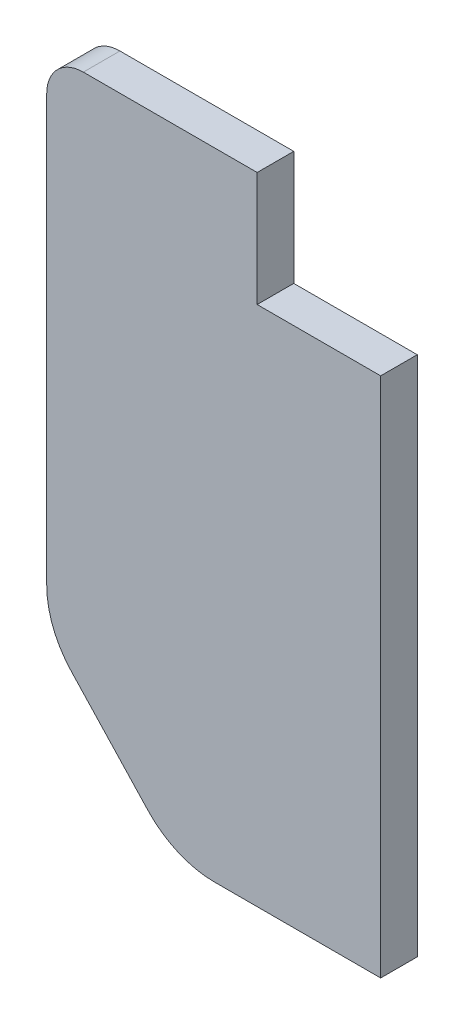
ISO-10303-21;
HEADER;
FILE_DESCRIPTION(('STEP AP214'),'2;1');
FILE_NAME('part.step','',(''),(''),'','','');
FILE_SCHEMA(('AUTOMOTIVE_DESIGN { 1 0 10303 214 1 1 1 1 }'));
ENDSEC;
DATA;
#1=APPLICATION_CONTEXT('core data for automotive mechanical design processes');
#2=APPLICATION_PROTOCOL_DEFINITION('international standard','automotive_design',2000,#1);
#3=PRODUCT_CONTEXT('',#1,'mechanical');
#4=PRODUCT('Part','Part','',(#3));
#5=PRODUCT_RELATED_PRODUCT_CATEGORY('part','',(#4));
#6=PRODUCT_DEFINITION_FORMATION('','',#4);
#7=PRODUCT_DEFINITION_CONTEXT('part definition',#1,'design');
#8=PRODUCT_DEFINITION('design','',#6,#7);
#9=PRODUCT_DEFINITION_SHAPE('','',#8);
#10=(LENGTH_UNIT() NAMED_UNIT(*) SI_UNIT(.MILLI.,.METRE.));
#11=(NAMED_UNIT(*) PLANE_ANGLE_UNIT() SI_UNIT($,.RADIAN.));
#12=(NAMED_UNIT(*) SI_UNIT($,.STERADIAN.) SOLID_ANGLE_UNIT());
#13=UNCERTAINTY_MEASURE_WITH_UNIT(LENGTH_MEASURE(1.E-05),#10,'distance_accuracy_value','');
#14=(GEOMETRIC_REPRESENTATION_CONTEXT(3) GLOBAL_UNCERTAINTY_ASSIGNED_CONTEXT((#13)) GLOBAL_UNIT_ASSIGNED_CONTEXT((#10,
#11,#12)) REPRESENTATION_CONTEXT('',''));
#15=CARTESIAN_POINT('',(0.,0.,0.));
#16=DIRECTION('',(0.,0.,1.));
#17=DIRECTION('',(1.,0.,0.));
#18=AXIS2_PLACEMENT_3D('',#15,#16,#17);
#19=CARTESIAN_POINT('',(-45.,0.,8.));
#20=DIRECTION('',(0.,1.,0.));
#21=DIRECTION('',(0.,0.,1.));
#22=AXIS2_PLACEMENT_3D('',#19,#20,#21);
#23=PLANE('',#22);
#24=DIRECTION('',(1.,0.,0.));
#25=VECTOR('',#24,1.);
#26=CARTESIAN_POINT('',(-45.,0.,8.));
#27=LINE('',#26,#25);
#28=CARTESIAN_POINT('',(-36.3089539617557,0.,8.));
#29=VERTEX_POINT('',#28);
#30=CARTESIAN_POINT('',(0.,0.,8.));
#31=VERTEX_POINT('',#30);
#32=EDGE_CURVE('E112',#29,#31,#27,.T.);
#33=ORIENTED_EDGE('',*,*,#32,.F.);
#34=DIRECTION('',(0.,0.,-1.));
#35=VECTOR('',#34,1.);
#36=CARTESIAN_POINT('',(-36.3089539617557,0.,8.));
#37=LINE('',#36,#35);
#38=CARTESIAN_POINT('',(-36.3089539617557,0.,0.));
#39=VERTEX_POINT('',#38);
#40=EDGE_CURVE('E150',#29,#39,#37,.T.);
#41=ORIENTED_EDGE('',*,*,#40,.T.);
#42=DIRECTION('',(1.,0.,0.));
#43=VECTOR('',#42,1.);
#44=CARTESIAN_POINT('',(-45.,0.,0.));
#45=LINE('',#44,#43);
#46=CARTESIAN_POINT('',(0.,0.,0.));
#47=VERTEX_POINT('',#46);
#48=EDGE_CURVE('E134',#39,#47,#45,.T.);
#49=ORIENTED_EDGE('',*,*,#48,.T.);
#50=DIRECTION('',(0.,0.,-1.));
#51=VECTOR('',#50,1.);
#52=CARTESIAN_POINT('',(0.,0.,8.));
#53=LINE('',#52,#51);
#54=EDGE_CURVE('E127',#31,#47,#53,.T.);
#55=ORIENTED_EDGE('',*,*,#54,.F.);
#56=EDGE_LOOP('',(#33,#41,#49,#55));
#57=FACE_BOUND('',#56,.T.);
#58=ADVANCED_FACE('F34',(#57),#23,.F.);
#59=CARTESIAN_POINT('',(0.,0.,8.));
#60=DIRECTION('',(-1.,0.,0.));
#61=DIRECTION('',(0.,0.,1.));
#62=AXIS2_PLACEMENT_3D('',#59,#60,#61);
#63=PLANE('',#62);
#64=DIRECTION('',(0.,1.,0.));
#65=VECTOR('',#64,1.);
#66=CARTESIAN_POINT('',(0.,0.,0.));
#67=LINE('',#66,#65);
#68=CARTESIAN_POINT('',(0.,114.,0.));
#69=VERTEX_POINT('',#68);
#70=EDGE_CURVE('E197',#47,#69,#67,.T.);
#71=ORIENTED_EDGE('',*,*,#70,.T.);
#72=DIRECTION('',(0.,0.,-1.));
#73=VECTOR('',#72,1.);
#74=CARTESIAN_POINT('',(0.,114.,8.));
#75=LINE('',#74,#73);
#76=CARTESIAN_POINT('',(0.,114.,8.));
#77=VERTEX_POINT('',#76);
#78=EDGE_CURVE('E129',#77,#69,#75,.T.);
#79=ORIENTED_EDGE('',*,*,#78,.F.);
#80=DIRECTION('',(0.,1.,0.));
#81=VECTOR('',#80,1.);
#82=CARTESIAN_POINT('',(0.,0.,8.));
#83=LINE('',#82,#81);
#84=EDGE_CURVE('E115',#31,#77,#83,.T.);
#85=ORIENTED_EDGE('',*,*,#84,.F.);
#86=ORIENTED_EDGE('',*,*,#54,.T.);
#87=EDGE_LOOP('',(#71,#79,#85,#86));
#88=FACE_BOUND('',#87,.T.);
#89=ADVANCED_FACE('F126',(#88),#63,.F.);
#90=CARTESIAN_POINT('',(0.,114.,8.));
#91=DIRECTION('',(0.,-1.,0.));
#92=DIRECTION('',(0.,0.,-1.));
#93=AXIS2_PLACEMENT_3D('',#90,#91,#92);
#94=PLANE('',#93);
#95=DIRECTION('',(-1.,0.,0.));
#96=VECTOR('',#95,1.);
#97=CARTESIAN_POINT('',(0.,114.,0.));
#98=LINE('',#97,#96);
#99=CARTESIAN_POINT('',(-27.,114.,0.));
#100=VERTEX_POINT('',#99);
#101=EDGE_CURVE('E196',#69,#100,#98,.T.);
#102=ORIENTED_EDGE('',*,*,#101,.T.);
#103=DIRECTION('',(0.,0.,-1.));
#104=VECTOR('',#103,1.);
#105=CARTESIAN_POINT('',(-27.,114.,8.));
#106=LINE('',#105,#104);
#107=CARTESIAN_POINT('',(-27.,114.,8.));
#108=VERTEX_POINT('',#107);
#109=EDGE_CURVE('E141',#108,#100,#106,.T.);
#110=ORIENTED_EDGE('',*,*,#109,.F.);
#111=DIRECTION('',(-1.,0.,0.));
#112=VECTOR('',#111,1.);
#113=CARTESIAN_POINT('',(0.,114.,8.));
#114=LINE('',#113,#112);
#115=EDGE_CURVE('E131',#77,#108,#114,.T.);
#116=ORIENTED_EDGE('',*,*,#115,.F.);
#117=ORIENTED_EDGE('',*,*,#78,.T.);
#118=EDGE_LOOP('',(#102,#110,#116,#117));
#119=FACE_BOUND('',#118,.T.);
#120=ADVANCED_FACE('F207',(#119),#94,.F.);
#121=CARTESIAN_POINT('',(-27.,114.,8.));
#122=DIRECTION('',(-1.,0.,0.));
#123=DIRECTION('',(0.,-1.,0.));
#124=AXIS2_PLACEMENT_3D('',#121,#122,#123);
#125=PLANE('',#124);
#126=DIRECTION('',(0.,1.,0.));
#127=VECTOR('',#126,1.);
#128=CARTESIAN_POINT('',(-27.,114.,0.));
#129=LINE('',#128,#127);
#130=CARTESIAN_POINT('',(-27.,139.,0.));
#131=VERTEX_POINT('',#130);
#132=EDGE_CURVE('E180',#100,#131,#129,.T.);
#133=ORIENTED_EDGE('',*,*,#132,.T.);
#134=DIRECTION('',(0.,0.,-1.));
#135=VECTOR('',#134,1.);
#136=CARTESIAN_POINT('',(-27.,139.,8.));
#137=LINE('',#136,#135);
#138=CARTESIAN_POINT('',(-27.,139.,8.));
#139=VERTEX_POINT('',#138);
#140=EDGE_CURVE('E168',#139,#131,#137,.T.);
#141=ORIENTED_EDGE('',*,*,#140,.F.);
#142=DIRECTION('',(0.,1.,0.));
#143=VECTOR('',#142,1.);
#144=CARTESIAN_POINT('',(-27.,114.,8.));
#145=LINE('',#144,#143);
#146=EDGE_CURVE('E192',#108,#139,#145,.T.);
#147=ORIENTED_EDGE('',*,*,#146,.F.);
#148=ORIENTED_EDGE('',*,*,#109,.T.);
#149=EDGE_LOOP('',(#133,#141,#147,#148));
#150=FACE_BOUND('',#149,.T.);
#151=ADVANCED_FACE('F190',(#150),#125,.F.);
#152=CARTESIAN_POINT('',(-27.,139.,8.));
#153=DIRECTION('',(0.,-1.,0.));
#154=DIRECTION('',(0.,0.,-1.));
#155=AXIS2_PLACEMENT_3D('',#152,#153,#154);
#156=PLANE('',#155);
#157=DIRECTION('',(-1.,0.,0.));
#158=VECTOR('',#157,1.);
#159=CARTESIAN_POINT('',(-27.,139.,0.));
#160=LINE('',#159,#158);
#161=CARTESIAN_POINT('',(-65.,139.,0.));
#162=VERTEX_POINT('',#161);
#163=EDGE_CURVE('E176',#131,#162,#160,.T.);
#164=ORIENTED_EDGE('',*,*,#163,.T.);
#165=DIRECTION('',(0.,0.,-1.));
#166=VECTOR('',#165,1.);
#167=CARTESIAN_POINT('',(-65.,139.,8.));
#168=LINE('',#167,#166);
#169=CARTESIAN_POINT('',(-65.,139.,8.));
#170=VERTEX_POINT('',#169);
#171=EDGE_CURVE('E146',#162,#170,#168,.F.);
#172=ORIENTED_EDGE('',*,*,#171,.T.);
#173=DIRECTION('',(-1.,0.,0.));
#174=VECTOR('',#173,1.);
#175=CARTESIAN_POINT('',(-27.,139.,8.));
#176=LINE('',#175,#174);
#177=EDGE_CURVE('E203',#139,#170,#176,.T.);
#178=ORIENTED_EDGE('',*,*,#177,.F.);
#179=ORIENTED_EDGE('',*,*,#140,.T.);
#180=EDGE_LOOP('',(#164,#172,#178,#179));
#181=FACE_BOUND('',#180,.T.);
#182=ADVANCED_FACE('F214',(#181),#156,.F.);
#183=CARTESIAN_POINT('',(-73.,139.,8.));
#184=DIRECTION('',(1.,0.,0.));
#185=DIRECTION('',(0.,1.,0.));
#186=AXIS2_PLACEMENT_3D('',#183,#184,#185);
#187=PLANE('',#186);
#188=DIRECTION('',(0.,-1.,0.));
#189=VECTOR('',#188,1.);
#190=CARTESIAN_POINT('',(-73.,139.,0.));
#191=LINE('',#190,#189);
#192=CARTESIAN_POINT('',(-73.,131.,0.));
#193=VERTEX_POINT('',#192);
#194=CARTESIAN_POINT('',(-73.,37.8832636124046,0.));
#195=VERTEX_POINT('',#194);
#196=EDGE_CURVE('E173',#193,#195,#191,.T.);
#197=ORIENTED_EDGE('',*,*,#196,.T.);
#198=DIRECTION('',(0.,0.,-1.));
#199=VECTOR('',#198,1.);
#200=CARTESIAN_POINT('',(-73.,37.8832636124046,8.));
#201=LINE('',#200,#199);
#202=CARTESIAN_POINT('',(-73.,37.8832636124046,8.));
#203=VERTEX_POINT('',#202);
#204=EDGE_CURVE('E11',#195,#203,#201,.F.);
#205=ORIENTED_EDGE('',*,*,#204,.T.);
#206=DIRECTION('',(0.,-1.,0.));
#207=VECTOR('',#206,1.);
#208=CARTESIAN_POINT('',(-73.,139.,8.));
#209=LINE('',#208,#207);
#210=CARTESIAN_POINT('',(-73.,131.,8.));
#211=VERTEX_POINT('',#210);
#212=EDGE_CURVE('E163',#211,#203,#209,.T.);
#213=ORIENTED_EDGE('',*,*,#212,.F.);
#214=DIRECTION('',(0.,0.,-1.));
#215=VECTOR('',#214,1.);
#216=CARTESIAN_POINT('',(-73.,131.,8.));
#217=LINE('',#216,#215);
#218=EDGE_CURVE('E136',#211,#193,#217,.T.);
#219=ORIENTED_EDGE('',*,*,#218,.T.);
#220=EDGE_LOOP('',(#197,#205,#213,#219));
#221=FACE_BOUND('',#220,.T.);
#222=ADVANCED_FACE('F174',(#221),#187,.F.);
#223=CARTESIAN_POINT('',(-73.,30.,8.));
#224=DIRECTION('',(0.731055268242869,0.682318250360011,0.));
#225=DIRECTION('',(-0.682318250360011,0.731055268242869,0.));
#226=AXIS2_PLACEMENT_3D('',#223,#224,#225);
#227=PLANE('',#226);
#228=DIRECTION('',(0.682318250360011,-0.731055268242869,0.));
#229=VECTOR('',#228,1.);
#230=CARTESIAN_POINT('',(-73.,30.,0.));
#231=LINE('',#230,#229);
#232=CARTESIAN_POINT('',(-67.6211053648574,24.2368986052043,0.));
#233=VERTEX_POINT('',#232);
#234=CARTESIAN_POINT('',(-50.9300593266131,6.35363499279978,0.));
#235=VERTEX_POINT('',#234);
#236=EDGE_CURVE('E122',#233,#235,#231,.T.);
#237=ORIENTED_EDGE('',*,*,#236,.T.);
#238=DIRECTION('',(0.,0.,-1.));
#239=VECTOR('',#238,1.);
#240=CARTESIAN_POINT('',(-50.9300593266131,6.35363499279978,8.));
#241=LINE('',#240,#239);
#242=CARTESIAN_POINT('',(-50.9300593266131,6.35363499279978,8.));
#243=VERTEX_POINT('',#242);
#244=EDGE_CURVE('E55',#235,#243,#241,.F.);
#245=ORIENTED_EDGE('',*,*,#244,.T.);
#246=DIRECTION('',(0.682318250360011,-0.731055268242869,0.));
#247=VECTOR('',#246,1.);
#248=CARTESIAN_POINT('',(-73.,30.,8.));
#249=LINE('',#248,#247);
#250=CARTESIAN_POINT('',(-67.6211053648574,24.2368986052043,8.));
#251=VERTEX_POINT('',#250);
#252=EDGE_CURVE('E162',#251,#243,#249,.T.);
#253=ORIENTED_EDGE('',*,*,#252,.F.);
#254=DIRECTION('',(0.,0.,-1.));
#255=VECTOR('',#254,1.);
#256=CARTESIAN_POINT('',(-67.6211053648574,24.2368986052043,8.));
#257=LINE('',#256,#255);
#258=EDGE_CURVE('E156',#251,#233,#257,.T.);
#259=ORIENTED_EDGE('',*,*,#258,.T.);
#260=EDGE_LOOP('',(#237,#245,#253,#259));
#261=FACE_BOUND('',#260,.T.);
#262=ADVANCED_FACE('F166',(#261),#227,.F.);
#263=CARTESIAN_POINT('',(0.,0.,8.));
#264=DIRECTION('',(0.,0.,1.));
#265=DIRECTION('',(1.,0.,0.));
#266=AXIS2_PLACEMENT_3D('',#263,#264,#265);
#267=PLANE('',#266);
#268=ORIENTED_EDGE('',*,*,#252,.T.);
#269=CARTESIAN_POINT('',(-36.3089539617557,20.,8.));
#270=DIRECTION('',(0.,0.,1.));
#271=DIRECTION('',(1.,0.,0.));
#272=AXIS2_PLACEMENT_3D('',#269,#270,#271);
#273=CIRCLE('',#272,20.);
#274=EDGE_CURVE('E42',#243,#29,#273,.T.);
#275=ORIENTED_EDGE('',*,*,#274,.T.);
#276=ORIENTED_EDGE('',*,*,#32,.T.);
#277=ORIENTED_EDGE('',*,*,#84,.T.);
#278=ORIENTED_EDGE('',*,*,#115,.T.);
#279=ORIENTED_EDGE('',*,*,#146,.T.);
#280=ORIENTED_EDGE('',*,*,#177,.T.);
#281=CARTESIAN_POINT('',(-65.,131.,8.));
#282=DIRECTION('',(0.,0.,1.));
#283=DIRECTION('',(1.,0.,0.));
#284=AXIS2_PLACEMENT_3D('',#281,#282,#283);
#285=CIRCLE('',#284,8.);
#286=EDGE_CURVE('E148',#170,#211,#285,.T.);
#287=ORIENTED_EDGE('',*,*,#286,.T.);
#288=ORIENTED_EDGE('',*,*,#212,.T.);
#289=CARTESIAN_POINT('',(-53.,37.8832636124046,8.));
#290=DIRECTION('',(0.,0.,1.));
#291=DIRECTION('',(1.,0.,0.));
#292=AXIS2_PLACEMENT_3D('',#289,#290,#291);
#293=CIRCLE('',#292,20.);
#294=EDGE_CURVE('E160',#203,#251,#293,.T.);
#295=ORIENTED_EDGE('',*,*,#294,.T.);
#296=EDGE_LOOP('',(#268,#275,#276,#277,#278,#279,#280,#287,#288,#295));
#297=FACE_BOUND('',#296,.T.);
#298=ADVANCED_FACE('F114',(#297),#267,.T.);
#299=CARTESIAN_POINT('',(0.,0.,0.));
#300=DIRECTION('',(0.,0.,1.));
#301=DIRECTION('',(1.,0.,0.));
#302=AXIS2_PLACEMENT_3D('',#299,#300,#301);
#303=PLANE('',#302);
#304=ORIENTED_EDGE('',*,*,#48,.F.);
#305=CARTESIAN_POINT('',(-36.3089539617557,20.,0.));
#306=DIRECTION('',(0.,0.,1.));
#307=DIRECTION('',(1.,0.,0.));
#308=AXIS2_PLACEMENT_3D('',#305,#306,#307);
#309=CIRCLE('',#308,20.);
#310=EDGE_CURVE('E154',#39,#235,#309,.F.);
#311=ORIENTED_EDGE('',*,*,#310,.T.);
#312=ORIENTED_EDGE('',*,*,#236,.F.);
#313=CARTESIAN_POINT('',(-53.,37.8832636124046,0.));
#314=DIRECTION('',(0.,0.,1.));
#315=DIRECTION('',(1.,0.,0.));
#316=AXIS2_PLACEMENT_3D('',#313,#314,#315);
#317=CIRCLE('',#316,20.);
#318=EDGE_CURVE('E152',#233,#195,#317,.F.);
#319=ORIENTED_EDGE('',*,*,#318,.T.);
#320=ORIENTED_EDGE('',*,*,#196,.F.);
#321=CARTESIAN_POINT('',(-65.,131.,0.));
#322=DIRECTION('',(0.,0.,1.));
#323=DIRECTION('',(1.,0.,0.));
#324=AXIS2_PLACEMENT_3D('',#321,#322,#323);
#325=CIRCLE('',#324,8.);
#326=EDGE_CURVE('E139',#193,#162,#325,.F.);
#327=ORIENTED_EDGE('',*,*,#326,.T.);
#328=ORIENTED_EDGE('',*,*,#163,.F.);
#329=ORIENTED_EDGE('',*,*,#132,.F.);
#330=ORIENTED_EDGE('',*,*,#101,.F.);
#331=ORIENTED_EDGE('',*,*,#70,.F.);
#332=EDGE_LOOP('',(#304,#311,#312,#319,#320,#327,#328,#329,#330,#331));
#333=FACE_BOUND('',#332,.T.);
#334=ADVANCED_FACE('F172',(#333),#303,.F.);
#335=CARTESIAN_POINT('',(-65.,131.,8.));
#336=DIRECTION('',(0.,0.,-1.));
#337=DIRECTION('',(-1.,0.,0.));
#338=AXIS2_PLACEMENT_3D('',#335,#336,#337);
#339=CYLINDRICAL_SURFACE('',#338,8.);
#340=ORIENTED_EDGE('',*,*,#286,.F.);
#341=ORIENTED_EDGE('',*,*,#171,.F.);
#342=ORIENTED_EDGE('',*,*,#326,.F.);
#343=ORIENTED_EDGE('',*,*,#218,.F.);
#344=EDGE_LOOP('',(#340,#341,#342,#343));
#345=FACE_BOUND('',#344,.T.);
#346=ADVANCED_FACE('F222',(#345),#339,.T.);
#347=CARTESIAN_POINT('',(-36.3089539617557,20.,8.));
#348=DIRECTION('',(0.,0.,-1.));
#349=DIRECTION('',(-1.,0.,0.));
#350=AXIS2_PLACEMENT_3D('',#347,#348,#349);
#351=CYLINDRICAL_SURFACE('',#350,20.);
#352=ORIENTED_EDGE('',*,*,#274,.F.);
#353=ORIENTED_EDGE('',*,*,#244,.F.);
#354=ORIENTED_EDGE('',*,*,#310,.F.);
#355=ORIENTED_EDGE('',*,*,#40,.F.);
#356=EDGE_LOOP('',(#352,#353,#354,#355));
#357=FACE_BOUND('',#356,.T.);
#358=ADVANCED_FACE('F224',(#357),#351,.T.);
#359=CARTESIAN_POINT('',(-53.,37.8832636124046,8.));
#360=DIRECTION('',(0.,0.,-1.));
#361=DIRECTION('',(-1.,0.,0.));
#362=AXIS2_PLACEMENT_3D('',#359,#360,#361);
#363=CYLINDRICAL_SURFACE('',#362,20.);
#364=ORIENTED_EDGE('',*,*,#294,.F.);
#365=ORIENTED_EDGE('',*,*,#204,.F.);
#366=ORIENTED_EDGE('',*,*,#318,.F.);
#367=ORIENTED_EDGE('',*,*,#258,.F.);
#368=EDGE_LOOP('',(#364,#365,#366,#367));
#369=FACE_BOUND('',#368,.T.);
#370=ADVANCED_FACE('F36',(#369),#363,.T.);
#371=CLOSED_SHELL('',(#58,#89,#120,#151,#182,#222,#262,#298,#334,#346,#358,#370));
#372=MANIFOLD_SOLID_BREP('B2',#371);
#373=ADVANCED_BREP_SHAPE_REPRESENTATION('',(#18,#372),#14);
#374=SHAPE_DEFINITION_REPRESENTATION(#9,#373);
ENDSEC;
END-ISO-10303-21;
